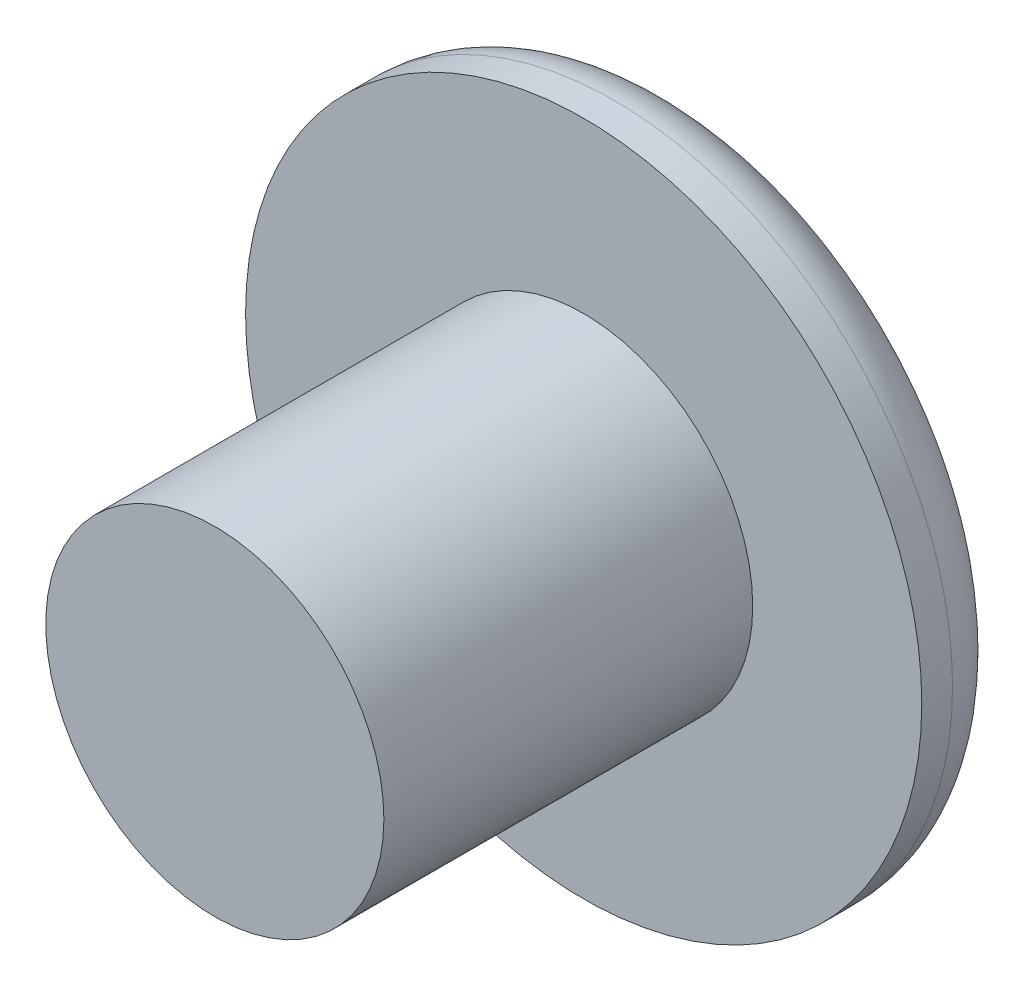
ISO-10303-21;
HEADER;
FILE_DESCRIPTION(('STEP AP214'),'2;1');
FILE_NAME('part.step','',(''),(''),'','','');
FILE_SCHEMA(('AUTOMOTIVE_DESIGN { 1 0 10303 214 1 1 1 1 }'));
ENDSEC;
DATA;
#1=APPLICATION_CONTEXT('core data for automotive mechanical design processes');
#2=APPLICATION_PROTOCOL_DEFINITION('international standard','automotive_design',2000,#1);
#3=PRODUCT_CONTEXT('',#1,'mechanical');
#4=PRODUCT('Part','Part','',(#3));
#5=PRODUCT_RELATED_PRODUCT_CATEGORY('part','',(#4));
#6=PRODUCT_DEFINITION_FORMATION('','',#4);
#7=PRODUCT_DEFINITION_CONTEXT('part definition',#1,'design');
#8=PRODUCT_DEFINITION('design','',#6,#7);
#9=PRODUCT_DEFINITION_SHAPE('','',#8);
#10=(LENGTH_UNIT() NAMED_UNIT(*) SI_UNIT(.MILLI.,.METRE.));
#11=(NAMED_UNIT(*) PLANE_ANGLE_UNIT() SI_UNIT($,.RADIAN.));
#12=(NAMED_UNIT(*) SI_UNIT($,.STERADIAN.) SOLID_ANGLE_UNIT());
#13=UNCERTAINTY_MEASURE_WITH_UNIT(LENGTH_MEASURE(1.E-05),#10,'distance_accuracy_value','');
#14=(GEOMETRIC_REPRESENTATION_CONTEXT(3) GLOBAL_UNCERTAINTY_ASSIGNED_CONTEXT((#13)) GLOBAL_UNIT_ASSIGNED_CONTEXT((#10,
#11,#12)) REPRESENTATION_CONTEXT('',''));
#15=CARTESIAN_POINT('',(0.,0.,0.));
#16=DIRECTION('',(0.,0.,1.));
#17=DIRECTION('',(1.,0.,0.));
#18=AXIS2_PLACEMENT_3D('',#15,#16,#17);
#19=CARTESIAN_POINT('',(0.,0.,3.));
#20=DIRECTION('',(0.,0.,-1.));
#21=DIRECTION('',(-1.,0.,0.));
#22=AXIS2_PLACEMENT_3D('',#19,#20,#21);
#23=CYLINDRICAL_SURFACE('',#22,11.);
#24=CARTESIAN_POINT('',(0.,0.,2.));
#25=DIRECTION('',(0.,0.,1.));
#26=DIRECTION('',(1.,0.,0.));
#27=AXIS2_PLACEMENT_3D('',#24,#25,#26);
#28=CIRCLE('',#27,11.);
#29=CARTESIAN_POINT('',(11.,0.,2.));
#30=VERTEX_POINT('',#29);
#31=EDGE_CURVE('E49',#30,#30,#28,.T.);
#32=ORIENTED_EDGE('',*,*,#31,.T.);
#33=EDGE_LOOP('',(#32));
#34=FACE_BOUND('',#33,.T.);
#35=CARTESIAN_POINT('',(0.,0.,3.));
#36=DIRECTION('',(0.,0.,1.));
#37=DIRECTION('',(1.,0.,0.));
#38=AXIS2_PLACEMENT_3D('',#35,#36,#37);
#39=CIRCLE('',#38,11.);
#40=CARTESIAN_POINT('',(11.,0.,3.));
#41=VERTEX_POINT('',#40);
#42=EDGE_CURVE('E59',#41,#41,#39,.T.);
#43=ORIENTED_EDGE('',*,*,#42,.F.);
#44=EDGE_LOOP('',(#43));
#45=FACE_BOUND('',#44,.T.);
#46=ADVANCED_FACE('F41',(#34,#45),#23,.T.);
#47=CARTESIAN_POINT('',(0.,0.,3.));
#48=DIRECTION('',(0.,0.,1.));
#49=DIRECTION('',(1.,0.,0.));
#50=AXIS2_PLACEMENT_3D('',#47,#48,#49);
#51=PLANE('',#50);
#52=CARTESIAN_POINT('',(0.,0.,3.));
#53=DIRECTION('',(0.,0.,1.));
#54=DIRECTION('',(1.,0.,0.));
#55=AXIS2_PLACEMENT_3D('',#52,#53,#54);
#56=CIRCLE('',#55,5.5);
#57=CARTESIAN_POINT('',(5.5,0.,3.));
#58=VERTEX_POINT('',#57);
#59=EDGE_CURVE('E54',#58,#58,#56,.T.);
#60=ORIENTED_EDGE('',*,*,#59,.F.);
#61=EDGE_LOOP('',(#60));
#62=FACE_BOUND('',#61,.T.);
#63=ORIENTED_EDGE('',*,*,#42,.T.);
#64=EDGE_LOOP('',(#63));
#65=FACE_BOUND('',#64,.T.);
#66=ADVANCED_FACE('F79',(#62,#65),#51,.T.);
#67=CARTESIAN_POINT('',(0.,0.,0.));
#68=DIRECTION('',(0.,0.,1.));
#69=DIRECTION('',(1.,0.,0.));
#70=AXIS2_PLACEMENT_3D('',#67,#68,#69);
#71=PLANE('',#70);
#72=CARTESIAN_POINT('',(0.,0.,0.));
#73=DIRECTION('',(0.,0.,1.));
#74=DIRECTION('',(1.,0.,0.));
#75=AXIS2_PLACEMENT_3D('',#72,#73,#74);
#76=CIRCLE('',#75,9.);
#77=CARTESIAN_POINT('',(9.,0.,0.));
#78=VERTEX_POINT('',#77);
#79=EDGE_CURVE('E10',#78,#78,#76,.F.);
#80=ORIENTED_EDGE('',*,*,#79,.T.);
#81=EDGE_LOOP('',(#80));
#82=FACE_BOUND('',#81,.T.);
#83=ADVANCED_FACE('F75',(#82),#71,.F.);
#84=CARTESIAN_POINT('',(0.,0.,15.));
#85=DIRECTION('',(0.,0.,-1.));
#86=DIRECTION('',(-1.,0.,0.));
#87=AXIS2_PLACEMENT_3D('',#84,#85,#86);
#88=CYLINDRICAL_SURFACE('',#87,5.5);
#89=CARTESIAN_POINT('',(0.,0.,15.));
#90=DIRECTION('',(0.,0.,1.));
#91=DIRECTION('',(1.,0.,0.));
#92=AXIS2_PLACEMENT_3D('',#89,#90,#91);
#93=CIRCLE('',#92,5.5);
#94=CARTESIAN_POINT('',(5.5,0.,15.));
#95=VERTEX_POINT('',#94);
#96=EDGE_CURVE('E64',#95,#95,#93,.T.);
#97=ORIENTED_EDGE('',*,*,#96,.F.);
#98=EDGE_LOOP('',(#97));
#99=FACE_BOUND('',#98,.T.);
#100=ORIENTED_EDGE('',*,*,#59,.T.);
#101=EDGE_LOOP('',(#100));
#102=FACE_BOUND('',#101,.T.);
#103=ADVANCED_FACE('F72',(#99,#102),#88,.T.);
#104=CARTESIAN_POINT('',(0.,0.,15.));
#105=DIRECTION('',(0.,0.,1.));
#106=DIRECTION('',(1.,0.,0.));
#107=AXIS2_PLACEMENT_3D('',#104,#105,#106);
#108=PLANE('',#107);
#109=ORIENTED_EDGE('',*,*,#96,.T.);
#110=EDGE_LOOP('',(#109));
#111=FACE_BOUND('',#110,.T.);
#112=ADVANCED_FACE('F70',(#111),#108,.T.);
#113=CARTESIAN_POINT('',(0.,0.,2.));
#114=DIRECTION('',(0.,0.,1.));
#115=DIRECTION('',(1.,0.,0.));
#116=AXIS2_PLACEMENT_3D('',#113,#114,#115);
#117=TOROIDAL_SURFACE('',#116,9.,2.);
#118=ORIENTED_EDGE('',*,*,#79,.F.);
#119=EDGE_LOOP('',(#118));
#120=FACE_BOUND('',#119,.T.);
#121=ORIENTED_EDGE('',*,*,#31,.F.);
#122=EDGE_LOOP('',(#121));
#123=FACE_BOUND('',#122,.T.);
#124=ADVANCED_FACE('F43',(#120,#123),#117,.T.);
#125=CLOSED_SHELL('',(#46,#66,#83,#103,#112,#124));
#126=MANIFOLD_SOLID_BREP('B2',#125);
#127=ADVANCED_BREP_SHAPE_REPRESENTATION('',(#18,#126),#14);
#128=SHAPE_DEFINITION_REPRESENTATION(#9,#127);
ENDSEC;
END-ISO-10303-21;
